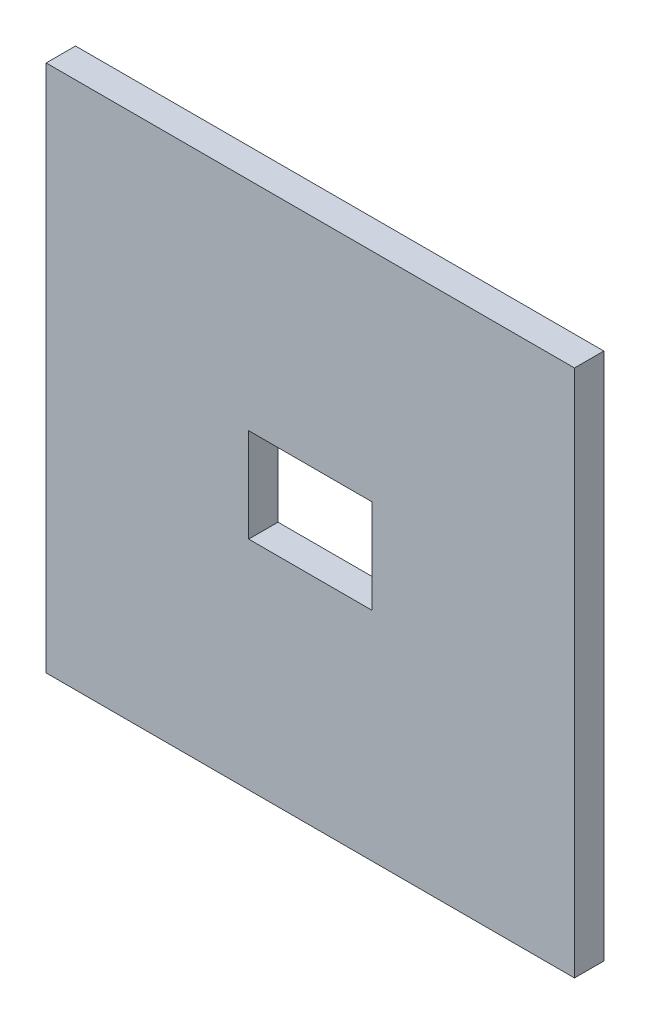
ISO-10303-21;
HEADER;
FILE_DESCRIPTION(('STEP AP214'),'2;1');
FILE_NAME('part.step','',(''),(''),'','','');
FILE_SCHEMA(('AUTOMOTIVE_DESIGN { 1 0 10303 214 1 1 1 1 }'));
ENDSEC;
DATA;
#1=APPLICATION_CONTEXT('core data for automotive mechanical design processes');
#2=APPLICATION_PROTOCOL_DEFINITION('international standard','automotive_design',2000,#1);
#3=PRODUCT_CONTEXT('',#1,'mechanical');
#4=PRODUCT('Part','Part','',(#3));
#5=PRODUCT_RELATED_PRODUCT_CATEGORY('part','',(#4));
#6=PRODUCT_DEFINITION_FORMATION('','',#4);
#7=PRODUCT_DEFINITION_CONTEXT('part definition',#1,'design');
#8=PRODUCT_DEFINITION('design','',#6,#7);
#9=PRODUCT_DEFINITION_SHAPE('','',#8);
#10=(LENGTH_UNIT() NAMED_UNIT(*) SI_UNIT(.MILLI.,.METRE.));
#11=(NAMED_UNIT(*) PLANE_ANGLE_UNIT() SI_UNIT($,.RADIAN.));
#12=(NAMED_UNIT(*) SI_UNIT($,.STERADIAN.) SOLID_ANGLE_UNIT());
#13=UNCERTAINTY_MEASURE_WITH_UNIT(LENGTH_MEASURE(1.E-05),#10,'distance_accuracy_value','');
#14=(GEOMETRIC_REPRESENTATION_CONTEXT(3) GLOBAL_UNCERTAINTY_ASSIGNED_CONTEXT((#13)) GLOBAL_UNIT_ASSIGNED_CONTEXT((#10,
#11,#12)) REPRESENTATION_CONTEXT('',''));
#15=CARTESIAN_POINT('',(0.,0.,0.));
#16=DIRECTION('',(0.,0.,1.));
#17=DIRECTION('',(1.,0.,0.));
#18=AXIS2_PLACEMENT_3D('',#15,#16,#17);
#19=CARTESIAN_POINT('',(-45.,45.,5.));
#20=DIRECTION('',(0.,1.,0.));
#21=DIRECTION('',(0.,0.,1.));
#22=AXIS2_PLACEMENT_3D('',#19,#20,#21);
#23=PLANE('',#22);
#24=DIRECTION('',(1.,0.,0.));
#25=VECTOR('',#24,1.);
#26=CARTESIAN_POINT('',(-45.,45.,0.));
#27=LINE('',#26,#25);
#28=CARTESIAN_POINT('',(-45.,45.,0.));
#29=VERTEX_POINT('',#28);
#30=CARTESIAN_POINT('',(45.,45.,0.));
#31=VERTEX_POINT('',#30);
#32=EDGE_CURVE('E153',#29,#31,#27,.T.);
#33=ORIENTED_EDGE('',*,*,#32,.F.);
#34=DIRECTION('',(0.,0.,-1.));
#35=VECTOR('',#34,1.);
#36=CARTESIAN_POINT('',(-45.,45.,5.));
#37=LINE('',#36,#35);
#38=CARTESIAN_POINT('',(-45.,45.,5.));
#39=VERTEX_POINT('',#38);
#40=EDGE_CURVE('E11',#39,#29,#37,.T.);
#41=ORIENTED_EDGE('',*,*,#40,.F.);
#42=DIRECTION('',(1.,0.,0.));
#43=VECTOR('',#42,1.);
#44=CARTESIAN_POINT('',(-45.,45.,5.));
#45=LINE('',#44,#43);
#46=CARTESIAN_POINT('',(45.,45.,5.));
#47=VERTEX_POINT('',#46);
#48=EDGE_CURVE('E157',#39,#47,#45,.T.);
#49=ORIENTED_EDGE('',*,*,#48,.T.);
#50=DIRECTION('',(0.,0.,-1.));
#51=VECTOR('',#50,1.);
#52=CARTESIAN_POINT('',(45.,45.,5.));
#53=LINE('',#52,#51);
#54=EDGE_CURVE('E50',#47,#31,#53,.T.);
#55=ORIENTED_EDGE('',*,*,#54,.T.);
#56=EDGE_LOOP('',(#33,#41,#49,#55));
#57=FACE_BOUND('',#56,.T.);
#58=ADVANCED_FACE('F42',(#57),#23,.T.);
#59=CARTESIAN_POINT('',(-45.,-45.,5.));
#60=DIRECTION('',(-1.,0.,0.));
#61=DIRECTION('',(0.,0.,1.));
#62=AXIS2_PLACEMENT_3D('',#59,#60,#61);
#63=PLANE('',#62);
#64=DIRECTION('',(0.,1.,0.));
#65=VECTOR('',#64,1.);
#66=CARTESIAN_POINT('',(-45.,-45.,0.));
#67=LINE('',#66,#65);
#68=CARTESIAN_POINT('',(-45.,-45.,0.));
#69=VERTEX_POINT('',#68);
#70=EDGE_CURVE('E163',#69,#29,#67,.T.);
#71=ORIENTED_EDGE('',*,*,#70,.F.);
#72=DIRECTION('',(0.,0.,-1.));
#73=VECTOR('',#72,1.);
#74=CARTESIAN_POINT('',(-45.,-45.,5.));
#75=LINE('',#74,#73);
#76=CARTESIAN_POINT('',(-45.,-45.,5.));
#77=VERTEX_POINT('',#76);
#78=EDGE_CURVE('E52',#77,#69,#75,.T.);
#79=ORIENTED_EDGE('',*,*,#78,.F.);
#80=DIRECTION('',(0.,1.,0.));
#81=VECTOR('',#80,1.);
#82=CARTESIAN_POINT('',(-45.,-45.,5.));
#83=LINE('',#82,#81);
#84=EDGE_CURVE('E171',#77,#39,#83,.T.);
#85=ORIENTED_EDGE('',*,*,#84,.T.);
#86=ORIENTED_EDGE('',*,*,#40,.T.);
#87=EDGE_LOOP('',(#71,#79,#85,#86));
#88=FACE_BOUND('',#87,.T.);
#89=ADVANCED_FACE('F206',(#88),#63,.T.);
#90=CARTESIAN_POINT('',(45.,-45.,5.));
#91=DIRECTION('',(0.,-1.,0.));
#92=DIRECTION('',(0.,0.,-1.));
#93=AXIS2_PLACEMENT_3D('',#90,#91,#92);
#94=PLANE('',#93);
#95=DIRECTION('',(-1.,0.,0.));
#96=VECTOR('',#95,1.);
#97=CARTESIAN_POINT('',(45.,-45.,0.));
#98=LINE('',#97,#96);
#99=CARTESIAN_POINT('',(45.,-45.,0.));
#100=VERTEX_POINT('',#99);
#101=EDGE_CURVE('E181',#100,#69,#98,.T.);
#102=ORIENTED_EDGE('',*,*,#101,.F.);
#103=DIRECTION('',(0.,0.,-1.));
#104=VECTOR('',#103,1.);
#105=CARTESIAN_POINT('',(45.,-45.,5.));
#106=LINE('',#105,#104);
#107=CARTESIAN_POINT('',(45.,-45.,5.));
#108=VERTEX_POINT('',#107);
#109=EDGE_CURVE('E192',#108,#100,#106,.T.);
#110=ORIENTED_EDGE('',*,*,#109,.F.);
#111=DIRECTION('',(-1.,0.,0.));
#112=VECTOR('',#111,1.);
#113=CARTESIAN_POINT('',(45.,-45.,5.));
#114=LINE('',#113,#112);
#115=EDGE_CURVE('E169',#108,#77,#114,.T.);
#116=ORIENTED_EDGE('',*,*,#115,.T.);
#117=ORIENTED_EDGE('',*,*,#78,.T.);
#118=EDGE_LOOP('',(#102,#110,#116,#117));
#119=FACE_BOUND('',#118,.T.);
#120=ADVANCED_FACE('F209',(#119),#94,.T.);
#121=CARTESIAN_POINT('',(45.,45.,5.));
#122=DIRECTION('',(1.,0.,0.));
#123=DIRECTION('',(0.,0.,-1.));
#124=AXIS2_PLACEMENT_3D('',#121,#122,#123);
#125=PLANE('',#124);
#126=DIRECTION('',(0.,-1.,0.));
#127=VECTOR('',#126,1.);
#128=CARTESIAN_POINT('',(45.,45.,0.));
#129=LINE('',#128,#127);
#130=EDGE_CURVE('E177',#31,#100,#129,.T.);
#131=ORIENTED_EDGE('',*,*,#130,.F.);
#132=ORIENTED_EDGE('',*,*,#54,.F.);
#133=DIRECTION('',(0.,-1.,0.));
#134=VECTOR('',#133,1.);
#135=CARTESIAN_POINT('',(45.,45.,5.));
#136=LINE('',#135,#134);
#137=EDGE_CURVE('E162',#47,#108,#136,.T.);
#138=ORIENTED_EDGE('',*,*,#137,.T.);
#139=ORIENTED_EDGE('',*,*,#109,.T.);
#140=EDGE_LOOP('',(#131,#132,#138,#139));
#141=FACE_BOUND('',#140,.T.);
#142=ADVANCED_FACE('F203',(#141),#125,.T.);
#143=CARTESIAN_POINT('',(0.,0.,5.));
#144=DIRECTION('',(0.,0.,-1.));
#145=DIRECTION('',(-1.,0.,0.));
#146=AXIS2_PLACEMENT_3D('',#143,#144,#145);
#147=PLANE('',#146);
#148=DIRECTION('',(1.,0.,0.));
#149=VECTOR('',#148,1.);
#150=CARTESIAN_POINT('',(10.5,8.,5.));
#151=LINE('',#150,#149);
#152=CARTESIAN_POINT('',(-10.5,8.,5.));
#153=VERTEX_POINT('',#152);
#154=CARTESIAN_POINT('',(10.5,8.,5.));
#155=VERTEX_POINT('',#154);
#156=EDGE_CURVE('E118',#153,#155,#151,.T.);
#157=ORIENTED_EDGE('',*,*,#156,.T.);
#158=DIRECTION('',(0.,-1.,0.));
#159=VECTOR('',#158,1.);
#160=CARTESIAN_POINT('',(10.5,-8.,5.));
#161=LINE('',#160,#159);
#162=CARTESIAN_POINT('',(10.5,-8.,5.));
#163=VERTEX_POINT('',#162);
#164=EDGE_CURVE('E115',#155,#163,#161,.T.);
#165=ORIENTED_EDGE('',*,*,#164,.T.);
#166=DIRECTION('',(-1.,0.,0.));
#167=VECTOR('',#166,1.);
#168=CARTESIAN_POINT('',(-10.5,-8.,5.));
#169=LINE('',#168,#167);
#170=CARTESIAN_POINT('',(-10.5,-8.,5.));
#171=VERTEX_POINT('',#170);
#172=EDGE_CURVE('E125',#163,#171,#169,.T.);
#173=ORIENTED_EDGE('',*,*,#172,.T.);
#174=DIRECTION('',(0.,1.,0.));
#175=VECTOR('',#174,1.);
#176=CARTESIAN_POINT('',(-10.5,8.,5.));
#177=LINE('',#176,#175);
#178=EDGE_CURVE('E64',#171,#153,#177,.T.);
#179=ORIENTED_EDGE('',*,*,#178,.T.);
#180=EDGE_LOOP('',(#157,#165,#173,#179));
#181=FACE_BOUND('',#180,.T.);
#182=ORIENTED_EDGE('',*,*,#48,.F.);
#183=ORIENTED_EDGE('',*,*,#84,.F.);
#184=ORIENTED_EDGE('',*,*,#115,.F.);
#185=ORIENTED_EDGE('',*,*,#137,.F.);
#186=EDGE_LOOP('',(#182,#183,#184,#185));
#187=FACE_BOUND('',#186,.T.);
#188=ADVANCED_FACE('F130',(#181,#187),#147,.F.);
#189=CARTESIAN_POINT('',(0.,0.,0.));
#190=DIRECTION('',(0.,0.,-1.));
#191=DIRECTION('',(-1.,0.,0.));
#192=AXIS2_PLACEMENT_3D('',#189,#190,#191);
#193=PLANE('',#192);
#194=DIRECTION('',(0.,-1.,0.));
#195=VECTOR('',#194,1.);
#196=CARTESIAN_POINT('',(10.5,-8.,0.));
#197=LINE('',#196,#195);
#198=CARTESIAN_POINT('',(10.5,8.,0.));
#199=VERTEX_POINT('',#198);
#200=CARTESIAN_POINT('',(10.5,-8.,0.));
#201=VERTEX_POINT('',#200);
#202=EDGE_CURVE('E67',#199,#201,#197,.T.);
#203=ORIENTED_EDGE('',*,*,#202,.F.);
#204=DIRECTION('',(1.,0.,0.));
#205=VECTOR('',#204,1.);
#206=CARTESIAN_POINT('',(10.5,8.,0.));
#207=LINE('',#206,#205);
#208=CARTESIAN_POINT('',(-10.5,8.,0.));
#209=VERTEX_POINT('',#208);
#210=EDGE_CURVE('E132',#209,#199,#207,.T.);
#211=ORIENTED_EDGE('',*,*,#210,.F.);
#212=DIRECTION('',(0.,1.,0.));
#213=VECTOR('',#212,1.);
#214=CARTESIAN_POINT('',(-10.5,8.,0.));
#215=LINE('',#214,#213);
#216=CARTESIAN_POINT('',(-10.5,-8.,0.));
#217=VERTEX_POINT('',#216);
#218=EDGE_CURVE('E133',#217,#209,#215,.T.);
#219=ORIENTED_EDGE('',*,*,#218,.F.);
#220=DIRECTION('',(-1.,0.,0.));
#221=VECTOR('',#220,1.);
#222=CARTESIAN_POINT('',(-10.5,-8.,0.));
#223=LINE('',#222,#221);
#224=EDGE_CURVE('E145',#201,#217,#223,.T.);
#225=ORIENTED_EDGE('',*,*,#224,.F.);
#226=EDGE_LOOP('',(#203,#211,#219,#225));
#227=FACE_BOUND('',#226,.T.);
#228=ORIENTED_EDGE('',*,*,#32,.T.);
#229=ORIENTED_EDGE('',*,*,#130,.T.);
#230=ORIENTED_EDGE('',*,*,#101,.T.);
#231=ORIENTED_EDGE('',*,*,#70,.T.);
#232=EDGE_LOOP('',(#228,#229,#230,#231));
#233=FACE_BOUND('',#232,.T.);
#234=ADVANCED_FACE('F201',(#227,#233),#193,.T.);
#235=CARTESIAN_POINT('',(10.5,-8.,5.));
#236=DIRECTION('',(1.,0.,0.));
#237=DIRECTION('',(0.,0.,-1.));
#238=AXIS2_PLACEMENT_3D('',#235,#236,#237);
#239=PLANE('',#238);
#240=ORIENTED_EDGE('',*,*,#202,.T.);
#241=DIRECTION('',(0.,0.,-1.));
#242=VECTOR('',#241,1.);
#243=CARTESIAN_POINT('',(10.5,-8.,5.));
#244=LINE('',#243,#242);
#245=EDGE_CURVE('E107',#163,#201,#244,.T.);
#246=ORIENTED_EDGE('',*,*,#245,.F.);
#247=ORIENTED_EDGE('',*,*,#164,.F.);
#248=DIRECTION('',(0.,0.,-1.));
#249=VECTOR('',#248,1.);
#250=CARTESIAN_POINT('',(10.5,8.,5.));
#251=LINE('',#250,#249);
#252=EDGE_CURVE('E147',#155,#199,#251,.T.);
#253=ORIENTED_EDGE('',*,*,#252,.T.);
#254=EDGE_LOOP('',(#240,#246,#247,#253));
#255=FACE_BOUND('',#254,.T.);
#256=ADVANCED_FACE('F109',(#255),#239,.F.);
#257=CARTESIAN_POINT('',(10.5,8.,5.));
#258=DIRECTION('',(0.,1.,0.));
#259=DIRECTION('',(0.,0.,1.));
#260=AXIS2_PLACEMENT_3D('',#257,#258,#259);
#261=PLANE('',#260);
#262=ORIENTED_EDGE('',*,*,#210,.T.);
#263=ORIENTED_EDGE('',*,*,#252,.F.);
#264=ORIENTED_EDGE('',*,*,#156,.F.);
#265=DIRECTION('',(0.,0.,-1.));
#266=VECTOR('',#265,1.);
#267=CARTESIAN_POINT('',(-10.5,8.,5.));
#268=LINE('',#267,#266);
#269=EDGE_CURVE('E152',#153,#209,#268,.T.);
#270=ORIENTED_EDGE('',*,*,#269,.T.);
#271=EDGE_LOOP('',(#262,#263,#264,#270));
#272=FACE_BOUND('',#271,.T.);
#273=ADVANCED_FACE('F263',(#272),#261,.F.);
#274=CARTESIAN_POINT('',(-10.5,8.,5.));
#275=DIRECTION('',(-1.,0.,0.));
#276=DIRECTION('',(0.,-1.,0.));
#277=AXIS2_PLACEMENT_3D('',#274,#275,#276);
#278=PLANE('',#277);
#279=ORIENTED_EDGE('',*,*,#218,.T.);
#280=ORIENTED_EDGE('',*,*,#269,.F.);
#281=ORIENTED_EDGE('',*,*,#178,.F.);
#282=DIRECTION('',(0.,0.,-1.));
#283=VECTOR('',#282,1.);
#284=CARTESIAN_POINT('',(-10.5,-8.,5.));
#285=LINE('',#284,#283);
#286=EDGE_CURVE('E120',#171,#217,#285,.T.);
#287=ORIENTED_EDGE('',*,*,#286,.T.);
#288=EDGE_LOOP('',(#279,#280,#281,#287));
#289=FACE_BOUND('',#288,.T.);
#290=ADVANCED_FACE('F275',(#289),#278,.F.);
#291=CARTESIAN_POINT('',(-10.5,-8.,5.));
#292=DIRECTION('',(0.,-1.,0.));
#293=DIRECTION('',(0.,0.,-1.));
#294=AXIS2_PLACEMENT_3D('',#291,#292,#293);
#295=PLANE('',#294);
#296=ORIENTED_EDGE('',*,*,#224,.T.);
#297=ORIENTED_EDGE('',*,*,#286,.F.);
#298=ORIENTED_EDGE('',*,*,#172,.F.);
#299=ORIENTED_EDGE('',*,*,#245,.T.);
#300=EDGE_LOOP('',(#296,#297,#298,#299));
#301=FACE_BOUND('',#300,.T.);
#302=ADVANCED_FACE('F123',(#301),#295,.F.);
#303=CLOSED_SHELL('',(#58,#89,#120,#142,#188,#234,#256,#273,#290,#302));
#304=MANIFOLD_SOLID_BREP('B2',#303);
#305=ADVANCED_BREP_SHAPE_REPRESENTATION('',(#18,#304),#14);
#306=SHAPE_DEFINITION_REPRESENTATION(#9,#305);
ENDSEC;
END-ISO-10303-21;
